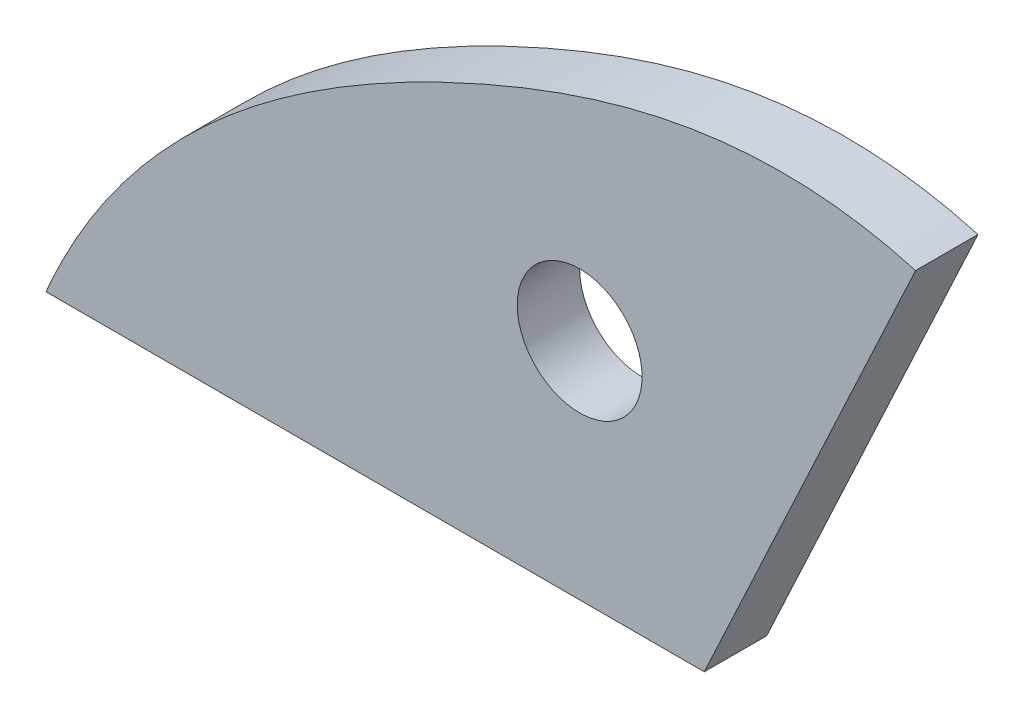
ISO-10303-21;
HEADER;
FILE_DESCRIPTION(('STEP AP214'),'2;1');
FILE_NAME('part.step','',(''),(''),'','','');
FILE_SCHEMA(('AUTOMOTIVE_DESIGN { 1 0 10303 214 1 1 1 1 }'));
ENDSEC;
DATA;
#1=APPLICATION_CONTEXT('core data for automotive mechanical design processes');
#2=APPLICATION_PROTOCOL_DEFINITION('international standard','automotive_design',2000,#1);
#3=PRODUCT_CONTEXT('',#1,'mechanical');
#4=PRODUCT('Part','Part','',(#3));
#5=PRODUCT_RELATED_PRODUCT_CATEGORY('part','',(#4));
#6=PRODUCT_DEFINITION_FORMATION('','',#4);
#7=PRODUCT_DEFINITION_CONTEXT('part definition',#1,'design');
#8=PRODUCT_DEFINITION('design','',#6,#7);
#9=PRODUCT_DEFINITION_SHAPE('','',#8);
#10=(LENGTH_UNIT() NAMED_UNIT(*) SI_UNIT(.MILLI.,.METRE.));
#11=(NAMED_UNIT(*) PLANE_ANGLE_UNIT() SI_UNIT($,.RADIAN.));
#12=(NAMED_UNIT(*) SI_UNIT($,.STERADIAN.) SOLID_ANGLE_UNIT());
#13=UNCERTAINTY_MEASURE_WITH_UNIT(LENGTH_MEASURE(1.E-05),#10,'distance_accuracy_value','');
#14=(GEOMETRIC_REPRESENTATION_CONTEXT(3) GLOBAL_UNCERTAINTY_ASSIGNED_CONTEXT((#13)) GLOBAL_UNIT_ASSIGNED_CONTEXT((#10,
#11,#12)) REPRESENTATION_CONTEXT('',''));
#15=CARTESIAN_POINT('',(0.,0.,0.));
#16=DIRECTION('',(0.,0.,1.));
#17=DIRECTION('',(1.,0.,0.));
#18=AXIS2_PLACEMENT_3D('',#15,#16,#17);
#19=CARTESIAN_POINT('',(445.212905348947,444.247707326745,76.2));
#20=DIRECTION('',(0.,0.,-1.));
#21=DIRECTION('',(-1.,0.,0.));
#22=AXIS2_PLACEMENT_3D('',#19,#20,#21);
#23=PLANE('',#22);
#24=CARTESIAN_POINT('',(1061.64016370429,553.248824445723,76.2));
#25=CARTESIAN_POINT('',(874.028934523559,606.589884551205,76.2));
#26=CARTESIAN_POINT('',(453.429557148745,493.357749054742,76.2));
#27=CARTESIAN_POINT('',(100.683650406611,235.6193990828,76.2));
#28=CARTESIAN_POINT('',(0.,0.,76.2));
#29=B_SPLINE_CURVE_WITH_KNOTS('',3,(#24,#25,#26,#27,#28),.UNSPECIFIED.,.F.,.F.,(4,1,4),(0.,
0.433791441982094,1.),.UNSPECIFIED.);
#30=CARTESIAN_POINT('',(1061.64016370429,553.248824445723,76.2));
#31=VERTEX_POINT('',#30);
#32=CARTESIAN_POINT('',(0.,0.,76.2));
#33=VERTEX_POINT('',#32);
#34=EDGE_CURVE('E75',#31,#33,#29,.T.);
#35=ORIENTED_EDGE('',*,*,#34,.T.);
#36=DIRECTION('',(1.,0.,0.));
#37=VECTOR('',#36,1.);
#38=CARTESIAN_POINT('',(0.,0.,76.2));
#39=LINE('',#38,#37);
#40=CARTESIAN_POINT('',(803.656,0.,76.2));
#41=VERTEX_POINT('',#40);
#42=EDGE_CURVE('E71',#33,#41,#39,.T.);
#43=ORIENTED_EDGE('',*,*,#42,.T.);
#44=DIRECTION('',(0.422618261740697,0.906307787036651,0.));
#45=VECTOR('',#44,1.);
#46=CARTESIAN_POINT('',(803.656,0.,76.2));
#47=LINE('',#46,#45);
#48=EDGE_CURVE('E51',#41,#31,#47,.T.);
#49=ORIENTED_EDGE('',*,*,#48,.T.);
#50=EDGE_LOOP('',(#35,#43,#49));
#51=FACE_BOUND('',#50,.T.);
#52=CARTESIAN_POINT('',(651.537493425873,273.841324369385,76.2));
#53=DIRECTION('',(0.,0.,1.));
#54=DIRECTION('',(1.,0.,0.));
#55=AXIS2_PLACEMENT_3D('',#52,#53,#54);
#56=CIRCLE('',#55,76.2000000000001);
#57=CARTESIAN_POINT('',(575.337493425873,273.841324369385,76.2));
#58=VERTEX_POINT('',#57);
#59=EDGE_CURVE('E84',#58,#58,#56,.T.);
#60=ORIENTED_EDGE('',*,*,#59,.F.);
#61=EDGE_LOOP('',(#60));
#62=FACE_BOUND('',#61,.T.);
#63=ADVANCED_FACE('F33',(#51,#62),#23,.F.);
#64=CARTESIAN_POINT('',(445.212905348947,444.247707326745,0.));
#65=DIRECTION('',(0.,0.,-1.));
#66=DIRECTION('',(-1.,0.,0.));
#67=AXIS2_PLACEMENT_3D('',#64,#65,#66);
#68=PLANE('',#67);
#69=CARTESIAN_POINT('',(1061.64016370429,553.248824445723,0.));
#70=CARTESIAN_POINT('',(874.028934523559,606.589884551205,0.));
#71=CARTESIAN_POINT('',(453.429557148745,493.357749054742,0.));
#72=CARTESIAN_POINT('',(100.683650406611,235.6193990828,0.));
#73=CARTESIAN_POINT('',(0.,0.,0.));
#74=B_SPLINE_CURVE_WITH_KNOTS('',3,(#69,#70,#71,#72,#73),.UNSPECIFIED.,.F.,.F.,(4,1,4),(0.,
0.433791441982094,1.),.UNSPECIFIED.);
#75=CARTESIAN_POINT('',(1061.64016370429,553.248824445723,0.));
#76=VERTEX_POINT('',#75);
#77=CARTESIAN_POINT('',(0.,0.,0.));
#78=VERTEX_POINT('',#77);
#79=EDGE_CURVE('E81',#76,#78,#74,.T.);
#80=ORIENTED_EDGE('',*,*,#79,.F.);
#81=DIRECTION('',(0.422618261740697,0.906307787036651,0.));
#82=VECTOR('',#81,1.);
#83=CARTESIAN_POINT('',(803.656,0.,0.));
#84=LINE('',#83,#82);
#85=CARTESIAN_POINT('',(803.656,0.,0.));
#86=VERTEX_POINT('',#85);
#87=EDGE_CURVE('E68',#86,#76,#84,.T.);
#88=ORIENTED_EDGE('',*,*,#87,.F.);
#89=DIRECTION('',(1.,0.,0.));
#90=VECTOR('',#89,1.);
#91=CARTESIAN_POINT('',(0.,0.,0.));
#92=LINE('',#91,#90);
#93=EDGE_CURVE('E63',#78,#86,#92,.T.);
#94=ORIENTED_EDGE('',*,*,#93,.F.);
#95=EDGE_LOOP('',(#80,#88,#94));
#96=FACE_BOUND('',#95,.T.);
#97=CARTESIAN_POINT('',(651.537493425873,273.841324369385,0.));
#98=DIRECTION('',(0.,0.,1.));
#99=DIRECTION('',(1.,0.,0.));
#100=AXIS2_PLACEMENT_3D('',#97,#98,#99);
#101=CIRCLE('',#100,76.2000000000001);
#102=CARTESIAN_POINT('',(575.337493425873,273.841324369385,0.));
#103=VERTEX_POINT('',#102);
#104=EDGE_CURVE('E88',#103,#103,#101,.T.);
#105=ORIENTED_EDGE('',*,*,#104,.T.);
#106=EDGE_LOOP('',(#105));
#107=FACE_BOUND('',#106,.T.);
#108=ADVANCED_FACE('F99',(#96,#107),#68,.T.);
#109=DIRECTION('',(0.,0.,-1.));
#110=VECTOR('',#109,1.);
#111=SURFACE_OF_LINEAR_EXTRUSION('',#29,#110);
#112=ORIENTED_EDGE('',*,*,#79,.T.);
#113=DIRECTION('',(0.,0.,-1.));
#114=VECTOR('',#113,1.);
#115=CARTESIAN_POINT('',(0.,0.,76.2));
#116=LINE('',#115,#114);
#117=EDGE_CURVE('E11',#33,#78,#116,.T.);
#118=ORIENTED_EDGE('',*,*,#117,.F.);
#119=ORIENTED_EDGE('',*,*,#34,.F.);
#120=DIRECTION('',(0.,0.,-1.));
#121=VECTOR('',#120,1.);
#122=CARTESIAN_POINT('',(1061.64016370429,553.248824445723,76.2));
#123=LINE('',#122,#121);
#124=EDGE_CURVE('E82',#31,#76,#123,.T.);
#125=ORIENTED_EDGE('',*,*,#124,.T.);
#126=EDGE_LOOP('',(#112,#118,#119,#125));
#127=FACE_BOUND('',#126,.T.);
#128=ADVANCED_FACE('F35',(#127),#111,.F.);
#129=CARTESIAN_POINT('',(0.,0.,76.2));
#130=DIRECTION('',(0.,1.,0.));
#131=DIRECTION('',(0.,0.,1.));
#132=AXIS2_PLACEMENT_3D('',#129,#130,#131);
#133=PLANE('',#132);
#134=ORIENTED_EDGE('',*,*,#93,.T.);
#135=DIRECTION('',(0.,0.,-1.));
#136=VECTOR('',#135,1.);
#137=CARTESIAN_POINT('',(803.656,0.,76.2));
#138=LINE('',#137,#136);
#139=EDGE_CURVE('E43',#41,#86,#138,.T.);
#140=ORIENTED_EDGE('',*,*,#139,.F.);
#141=ORIENTED_EDGE('',*,*,#42,.F.);
#142=ORIENTED_EDGE('',*,*,#117,.T.);
#143=EDGE_LOOP('',(#134,#140,#141,#142));
#144=FACE_BOUND('',#143,.T.);
#145=ADVANCED_FACE('F72',(#144),#133,.F.);
#146=CARTESIAN_POINT('',(803.656,0.,76.2));
#147=DIRECTION('',(-0.906307787036651,0.422618261740697,0.));
#148=DIRECTION('',(-0.422618261740697,-0.906307787036651,0.));
#149=AXIS2_PLACEMENT_3D('',#146,#147,#148);
#150=PLANE('',#149);
#151=ORIENTED_EDGE('',*,*,#87,.T.);
#152=ORIENTED_EDGE('',*,*,#124,.F.);
#153=ORIENTED_EDGE('',*,*,#48,.F.);
#154=ORIENTED_EDGE('',*,*,#139,.T.);
#155=EDGE_LOOP('',(#151,#152,#153,#154));
#156=FACE_BOUND('',#155,.T.);
#157=ADVANCED_FACE('F98',(#156),#150,.F.);
#158=CARTESIAN_POINT('',(651.537493425873,273.841324369385,76.2));
#159=DIRECTION('',(0.,0.,-1.));
#160=DIRECTION('',(-1.,0.,0.));
#161=AXIS2_PLACEMENT_3D('',#158,#159,#160);
#162=CYLINDRICAL_SURFACE('',#161,76.2000000000001);
#163=CARTESIAN_POINT('',(575.337493425873,273.841324369385,76.2));
#164=CARTESIAN_POINT('',(575.337493425873,273.841324369385,75.40625));
#165=CARTESIAN_POINT('',(575.337493425873,273.841324369385,74.6125));
#166=CARTESIAN_POINT('',(575.337493425873,273.841324369385,73.025));
#167=CARTESIAN_POINT('',(575.337493425873,273.841324369385,72.23125));
#168=CARTESIAN_POINT('',(575.337493425873,273.841324369385,70.64375));
#169=CARTESIAN_POINT('',(575.337493425873,273.841324369385,69.85));
#170=CARTESIAN_POINT('',(575.337493425873,273.841324369385,68.2625));
#171=CARTESIAN_POINT('',(575.337493425873,273.841324369385,67.46875));
#172=CARTESIAN_POINT('',(575.337493425873,273.841324369385,65.88125));
#173=CARTESIAN_POINT('',(575.337493425873,273.841324369385,65.0875));
#174=CARTESIAN_POINT('',(575.337493425873,273.841324369385,63.5));
#175=CARTESIAN_POINT('',(575.337493425873,273.841324369385,62.70625));
#176=CARTESIAN_POINT('',(575.337493425873,273.841324369385,61.11875));
#177=CARTESIAN_POINT('',(575.337493425873,273.841324369385,60.325));
#178=CARTESIAN_POINT('',(575.337493425873,273.841324369385,58.7375));
#179=CARTESIAN_POINT('',(575.337493425873,273.841324369385,57.94375));
#180=CARTESIAN_POINT('',(575.337493425873,273.841324369385,56.35625));
#181=CARTESIAN_POINT('',(575.337493425873,273.841324369385,55.5625));
#182=CARTESIAN_POINT('',(575.337493425873,273.841324369385,53.975));
#183=CARTESIAN_POINT('',(575.337493425873,273.841324369385,53.18125));
#184=CARTESIAN_POINT('',(575.337493425873,273.841324369385,51.59375));
#185=CARTESIAN_POINT('',(575.337493425873,273.841324369385,50.8));
#186=CARTESIAN_POINT('',(575.337493425873,273.841324369385,49.2125));
#187=CARTESIAN_POINT('',(575.337493425873,273.841324369385,48.41875));
#188=CARTESIAN_POINT('',(575.337493425873,273.841324369385,46.83125));
#189=CARTESIAN_POINT('',(575.337493425873,273.841324369385,46.0375));
#190=CARTESIAN_POINT('',(575.337493425873,273.841324369385,44.45));
#191=CARTESIAN_POINT('',(575.337493425873,273.841324369385,43.65625));
#192=CARTESIAN_POINT('',(575.337493425873,273.841324369385,42.06875));
#193=CARTESIAN_POINT('',(575.337493425873,273.841324369385,41.275));
#194=CARTESIAN_POINT('',(575.337493425873,273.841324369385,39.6875));
#195=CARTESIAN_POINT('',(575.337493425873,273.841324369385,38.89375));
#196=CARTESIAN_POINT('',(575.337493425873,273.841324369385,37.30625));
#197=CARTESIAN_POINT('',(575.337493425873,273.841324369385,36.5125));
#198=CARTESIAN_POINT('',(575.337493425873,273.841324369385,34.925));
#199=CARTESIAN_POINT('',(575.337493425873,273.841324369385,34.13125));
#200=CARTESIAN_POINT('',(575.337493425873,273.841324369385,32.54375));
#201=CARTESIAN_POINT('',(575.337493425873,273.841324369385,31.75));
#202=CARTESIAN_POINT('',(575.337493425873,273.841324369385,30.1625));
#203=CARTESIAN_POINT('',(575.337493425873,273.841324369385,29.36875));
#204=CARTESIAN_POINT('',(575.337493425873,273.841324369385,27.78125));
#205=CARTESIAN_POINT('',(575.337493425873,273.841324369385,26.9875));
#206=CARTESIAN_POINT('',(575.337493425873,273.841324369385,25.4));
#207=CARTESIAN_POINT('',(575.337493425873,273.841324369385,24.60625));
#208=CARTESIAN_POINT('',(575.337493425873,273.841324369385,23.01875));
#209=CARTESIAN_POINT('',(575.337493425873,273.841324369385,22.225));
#210=CARTESIAN_POINT('',(575.337493425873,273.841324369385,20.6375));
#211=CARTESIAN_POINT('',(575.337493425873,273.841324369385,19.84375));
#212=CARTESIAN_POINT('',(575.337493425873,273.841324369385,18.25625));
#213=CARTESIAN_POINT('',(575.337493425873,273.841324369385,17.4625));
#214=CARTESIAN_POINT('',(575.337493425873,273.841324369385,15.875));
#215=CARTESIAN_POINT('',(575.337493425873,273.841324369385,15.08125));
#216=CARTESIAN_POINT('',(575.337493425873,273.841324369385,13.49375));
#217=CARTESIAN_POINT('',(575.337493425873,273.841324369385,12.7));
#218=CARTESIAN_POINT('',(575.337493425873,273.841324369385,11.1125));
#219=CARTESIAN_POINT('',(575.337493425873,273.841324369385,10.31875));
#220=CARTESIAN_POINT('',(575.337493425873,273.841324369385,8.73125));
#221=CARTESIAN_POINT('',(575.337493425873,273.841324369385,7.93750000000001));
#222=CARTESIAN_POINT('',(575.337493425873,273.841324369385,6.35));
#223=CARTESIAN_POINT('',(575.337493425873,273.841324369385,5.55625));
#224=CARTESIAN_POINT('',(575.337493425873,273.841324369385,3.96875));
#225=CARTESIAN_POINT('',(575.337493425873,273.841324369385,3.175));
#226=CARTESIAN_POINT('',(575.337493425873,273.841324369385,1.5875));
#227=CARTESIAN_POINT('',(575.337493425873,273.841324369385,0.793750000000001));
#228=CARTESIAN_POINT('',(575.337493425873,273.841324369385,0.));
#229=B_SPLINE_CURVE_WITH_KNOTS('',3,(#163,#164,#165,#166,#167,#168,#169,#170,#171,#172,#173,
#174,#175,#176,#177,#178,#179,#180,#181,#182,#183,#184,#185,#186,#187,#188,#189,#190,#191,#192,
#193,#194,#195,#196,#197,#198,#199,#200,#201,#202,#203,#204,#205,#206,#207,#208,#209,#210,#211,
#212,#213,#214,#215,#216,#217,#218,#219,#220,#221,#222,#223,#224,#225,#226,#227,#228),
.UNSPECIFIED.,.F.,.F.,(4,2,2,2,2,2,2,2,2,2,2,2,2,2,2,2,2,2,2,2,2,2,2,2,2,2,2,2,2,2,2,2,4),(0.,
2.38125,4.7625,7.14375,9.52500000000001,11.90625,14.2875,16.66875,19.05,21.43125,23.8125,
26.19375,28.575,30.95625,33.3375,35.71875,38.1,40.48125,42.8625,45.24375,47.625,50.00625,
52.3875,54.76875,57.15,59.53125,61.9125,64.29375,66.675,69.05625,71.4375,73.81875,76.2),.UNSPECIFIED.);
#230=EDGE_CURVE('BSEAM113',#58,#103,#229,.T.);
#231=ORIENTED_EDGE('',*,*,#59,.T.);
#232=ORIENTED_EDGE('',*,*,#104,.F.);
#233=ORIENTED_EDGE('',*,*,#230,.T.);
#234=ORIENTED_EDGE('',*,*,#230,.F.);
#235=EDGE_LOOP('',(#231,#233,#232,#234));
#236=FACE_BOUND('',#235,.T.);
#237=ADVANCED_FACE('F113',(#236),#162,.F.);
#238=CLOSED_SHELL('',(#63,#108,#128,#145,#157,#237));
#239=MANIFOLD_SOLID_BREP('B2',#238);
#240=ADVANCED_BREP_SHAPE_REPRESENTATION('',(#18,#239),#14);
#241=SHAPE_DEFINITION_REPRESENTATION(#9,#240);
ENDSEC;
END-ISO-10303-21;
